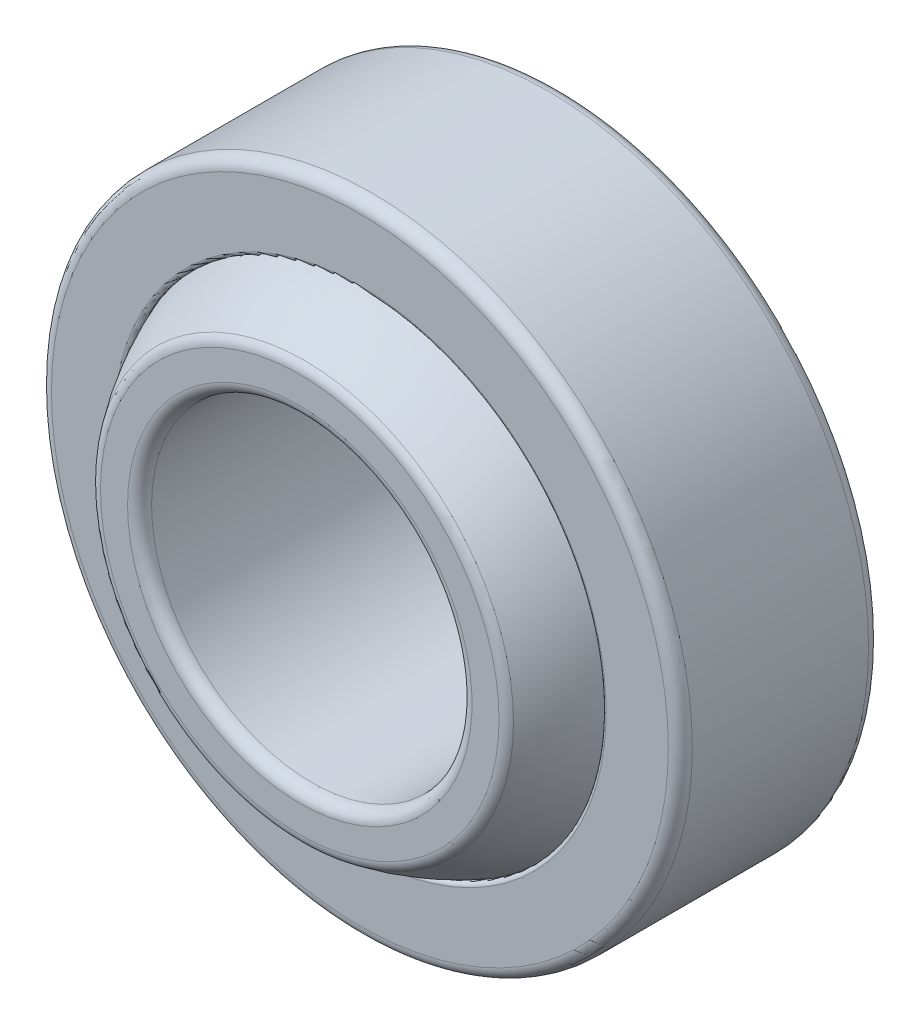
ISO-10303-21;
HEADER;
FILE_DESCRIPTION(('STEP AP214'),'2;1');
FILE_NAME('part.step','',(''),(''),'','','');
FILE_SCHEMA(('AUTOMOTIVE_DESIGN { 1 0 10303 214 1 1 1 1 }'));
ENDSEC;
DATA;
#1=APPLICATION_CONTEXT('core data for automotive mechanical design processes');
#2=APPLICATION_PROTOCOL_DEFINITION('international standard','automotive_design',2000,#1);
#3=PRODUCT_CONTEXT('',#1,'mechanical');
#4=PRODUCT('Part','Part','',(#3));
#5=PRODUCT_RELATED_PRODUCT_CATEGORY('part','',(#4));
#6=PRODUCT_DEFINITION_FORMATION('','',#4);
#7=PRODUCT_DEFINITION_CONTEXT('part definition',#1,'design');
#8=PRODUCT_DEFINITION('design','',#6,#7);
#9=PRODUCT_DEFINITION_SHAPE('','',#8);
#10=(LENGTH_UNIT() NAMED_UNIT(*) SI_UNIT(.MILLI.,.METRE.));
#11=(NAMED_UNIT(*) PLANE_ANGLE_UNIT() SI_UNIT($,.RADIAN.));
#12=(NAMED_UNIT(*) SI_UNIT($,.STERADIAN.) SOLID_ANGLE_UNIT());
#13=UNCERTAINTY_MEASURE_WITH_UNIT(LENGTH_MEASURE(1.E-05),#10,'distance_accuracy_value','');
#14=(GEOMETRIC_REPRESENTATION_CONTEXT(3) GLOBAL_UNCERTAINTY_ASSIGNED_CONTEXT((#13)) GLOBAL_UNIT_ASSIGNED_CONTEXT((#10,
#11,#12)) REPRESENTATION_CONTEXT('',''));
#15=CARTESIAN_POINT('',(0.,0.,0.));
#16=DIRECTION('',(0.,0.,1.));
#17=DIRECTION('',(1.,0.,0.));
#18=AXIS2_PLACEMENT_3D('',#15,#16,#17);
#19=CARTESIAN_POINT('',(0.,0.,0.));
#20=DIRECTION('',(-1.,0.,0.));
#21=DIRECTION('',(0.,0.,-1.));
#22=AXIS2_PLACEMENT_3D('',#19,#20,#21);
#23=SPHERICAL_SURFACE('',#22,6.5);
#24=CARTESIAN_POINT('',(0.,0.,0.));
#25=DIRECTION('',(0.,0.,1.));
#26=DIRECTION('',(1.,0.,0.));
#27=AXIS2_PLACEMENT_3D('',#24,#25,#26);
#28=SPHERICAL_SURFACE('',#27,6.5);
#29=CARTESIAN_POINT('',(0.,0.,-3.87903225806452));
#30=DIRECTION('',(0.,0.,1.));
#31=DIRECTION('',(1.,0.,0.));
#32=AXIS2_PLACEMENT_3D('',#29,#30,#31);
#33=CIRCLE('',#32,5.21565995257502);
#34=CARTESIAN_POINT('',(5.21565995257502,0.,-3.87903225806452));
#35=VERTEX_POINT('',#34);
#36=EDGE_CURVE('P0_E49',#35,#35,#33,.T.);
#37=ORIENTED_EDGE('',*,*,#36,.T.);
#38=EDGE_LOOP('',(#37));
#39=FACE_BOUND('',#38,.T.);
#40=CARTESIAN_POINT('',(0.,0.,3.87903225806452));
#41=DIRECTION('',(0.,0.,-1.));
#42=DIRECTION('',(-1.,0.,0.));
#43=AXIS2_PLACEMENT_3D('',#40,#41,#42);
#44=CIRCLE('',#43,5.21565995257502);
#45=CARTESIAN_POINT('',(-5.21565995257502,0.,3.87903225806452));
#46=VERTEX_POINT('',#45);
#47=EDGE_CURVE('P0_E53',#46,#46,#44,.T.);
#48=ORIENTED_EDGE('',*,*,#47,.T.);
#49=EDGE_LOOP('',(#48));
#50=FACE_BOUND('',#49,.T.);
#51=ADVANCED_FACE('P0_F14',(#39,#50),#28,.T.);
#52=CARTESIAN_POINT('',(-5.75777978288146,-6.5,4.));
#53=DIRECTION('',(0.,0.,-1.));
#54=DIRECTION('',(-1.,0.,0.));
#55=AXIS2_PLACEMENT_3D('',#52,#53,#54);
#56=PLANE('',#55);
#57=CARTESIAN_POINT('',(0.,0.,4.));
#58=DIRECTION('',(0.,0.,-1.));
#59=DIRECTION('',(-1.,0.,0.));
#60=AXIS2_PLACEMENT_3D('',#57,#58,#59);
#61=CIRCLE('',#60,4.9749371855331);
#62=CARTESIAN_POINT('',(-4.9749371855331,0.,4.));
#63=VERTEX_POINT('',#62);
#64=EDGE_CURVE('P0_E29',#63,#63,#61,.F.);
#65=ORIENTED_EDGE('',*,*,#64,.T.);
#66=EDGE_LOOP('',(#65));
#67=FACE_BOUND('',#66,.T.);
#68=CARTESIAN_POINT('',(0.,0.,4.));
#69=DIRECTION('',(0.,0.,-1.));
#70=DIRECTION('',(-1.,0.,0.));
#71=AXIS2_PLACEMENT_3D('',#68,#69,#70);
#72=CIRCLE('',#71,4.3);
#73=CARTESIAN_POINT('',(-4.3,0.,4.));
#74=VERTEX_POINT('',#73);
#75=EDGE_CURVE('P0_E35',#74,#74,#72,.T.);
#76=ORIENTED_EDGE('',*,*,#75,.T.);
#77=EDGE_LOOP('',(#76));
#78=FACE_BOUND('',#77,.T.);
#79=ADVANCED_FACE('P0_F77',(#67,#78),#56,.F.);
#80=CARTESIAN_POINT('',(-5.75777978288146,-6.5,-4.));
#81=DIRECTION('',(0.,0.,1.));
#82=DIRECTION('',(1.,0.,0.));
#83=AXIS2_PLACEMENT_3D('',#80,#81,#82);
#84=PLANE('',#83);
#85=CARTESIAN_POINT('',(0.,0.,-4.));
#86=DIRECTION('',(0.,0.,1.));
#87=DIRECTION('',(1.,0.,0.));
#88=AXIS2_PLACEMENT_3D('',#85,#86,#87);
#89=CIRCLE('',#88,4.9749371855331);
#90=CARTESIAN_POINT('',(4.9749371855331,0.,-4.));
#91=VERTEX_POINT('',#90);
#92=EDGE_CURVE('P0_E41',#91,#91,#89,.F.);
#93=ORIENTED_EDGE('',*,*,#92,.T.);
#94=EDGE_LOOP('',(#93));
#95=FACE_BOUND('',#94,.T.);
#96=CARTESIAN_POINT('',(0.,0.,-4.));
#97=DIRECTION('',(0.,0.,1.));
#98=DIRECTION('',(1.,0.,0.));
#99=AXIS2_PLACEMENT_3D('',#96,#97,#98);
#100=CIRCLE('',#99,4.3);
#101=CARTESIAN_POINT('',(4.3,0.,-4.));
#102=VERTEX_POINT('',#101);
#103=EDGE_CURVE('P0_E45',#102,#102,#100,.T.);
#104=ORIENTED_EDGE('',*,*,#103,.T.);
#105=EDGE_LOOP('',(#104));
#106=FACE_BOUND('',#105,.T.);
#107=ADVANCED_FACE('P0_F83',(#95,#106),#84,.F.);
#108=CARTESIAN_POINT('',(0.,0.,6.));
#109=DIRECTION('',(0.,0.,-1.));
#110=DIRECTION('',(-1.,0.,0.));
#111=AXIS2_PLACEMENT_3D('',#108,#109,#110);
#112=CYLINDRICAL_SURFACE('',#111,4.);
#113=CARTESIAN_POINT('',(0.,0.,3.7));
#114=DIRECTION('',(0.,0.,-1.));
#115=DIRECTION('',(-1.,0.,0.));
#116=AXIS2_PLACEMENT_3D('',#113,#114,#115);
#117=CIRCLE('',#116,4.);
#118=CARTESIAN_POINT('',(-4.,0.,3.7));
#119=VERTEX_POINT('',#118);
#120=EDGE_CURVE('P0_E10',#119,#119,#117,.F.);
#121=ORIENTED_EDGE('',*,*,#120,.T.);
#122=EDGE_LOOP('',(#121));
#123=FACE_BOUND('',#122,.T.);
#124=CARTESIAN_POINT('',(0.,0.,-3.7));
#125=DIRECTION('',(0.,0.,1.));
#126=DIRECTION('',(1.,0.,0.));
#127=AXIS2_PLACEMENT_3D('',#124,#125,#126);
#128=CIRCLE('',#127,4.);
#129=CARTESIAN_POINT('',(4.,0.,-3.7));
#130=VERTEX_POINT('',#129);
#131=EDGE_CURVE('P0_E22',#130,#130,#128,.F.);
#132=ORIENTED_EDGE('',*,*,#131,.T.);
#133=EDGE_LOOP('',(#132));
#134=FACE_BOUND('',#133,.T.);
#135=ADVANCED_FACE('P0_F72',(#123,#134),#112,.F.);
#136=CARTESIAN_POINT('',(0.,0.,-3.7));
#137=DIRECTION('',(0.,0.,1.));
#138=DIRECTION('',(1.,0.,0.));
#139=AXIS2_PLACEMENT_3D('',#136,#137,#138);
#140=TOROIDAL_SURFACE('',#139,4.9749371855331,0.3);
#141=ORIENTED_EDGE('',*,*,#92,.F.);
#142=EDGE_LOOP('',(#141));
#143=FACE_BOUND('',#142,.T.);
#144=ORIENTED_EDGE('',*,*,#36,.F.);
#145=EDGE_LOOP('',(#144));
#146=FACE_BOUND('',#145,.T.);
#147=ADVANCED_FACE('P0_F63',(#143,#146),#140,.T.);
#148=CARTESIAN_POINT('',(0.,0.,3.7));
#149=DIRECTION('',(0.,0.,-1.));
#150=DIRECTION('',(-1.,0.,0.));
#151=AXIS2_PLACEMENT_3D('',#148,#149,#150);
#152=TOROIDAL_SURFACE('',#151,4.9749371855331,0.3);
#153=ORIENTED_EDGE('',*,*,#64,.F.);
#154=EDGE_LOOP('',(#153));
#155=FACE_BOUND('',#154,.T.);
#156=ORIENTED_EDGE('',*,*,#47,.F.);
#157=EDGE_LOOP('',(#156));
#158=FACE_BOUND('',#157,.T.);
#159=ADVANCED_FACE('P0_F60',(#155,#158),#152,.T.);
#160=CARTESIAN_POINT('',(0.,0.,3.7));
#161=DIRECTION('',(0.,0.,-1.));
#162=DIRECTION('',(-1.,0.,0.));
#163=AXIS2_PLACEMENT_3D('',#160,#161,#162);
#164=TOROIDAL_SURFACE('',#163,4.3,0.3);
#165=ORIENTED_EDGE('',*,*,#120,.F.);
#166=EDGE_LOOP('',(#165));
#167=FACE_BOUND('',#166,.T.);
#168=ORIENTED_EDGE('',*,*,#75,.F.);
#169=EDGE_LOOP('',(#168));
#170=FACE_BOUND('',#169,.T.);
#171=ADVANCED_FACE('P0_F62',(#167,#170),#164,.T.);
#172=CARTESIAN_POINT('',(0.,0.,-3.7));
#173=DIRECTION('',(0.,0.,1.));
#174=DIRECTION('',(1.,0.,0.));
#175=AXIS2_PLACEMENT_3D('',#172,#173,#174);
#176=TOROIDAL_SURFACE('',#175,4.3,0.3);
#177=ORIENTED_EDGE('',*,*,#103,.F.);
#178=EDGE_LOOP('',(#177));
#179=FACE_BOUND('',#178,.T.);
#180=ORIENTED_EDGE('',*,*,#131,.F.);
#181=EDGE_LOOP('',(#180));
#182=FACE_BOUND('',#181,.T.);
#183=ADVANCED_FACE('P0_F16',(#179,#182),#176,.T.);
#184=CLOSED_SHELL('',(#51,#79,#107,#135,#147,#159,#171,#183));
#185=MANIFOLD_SOLID_BREP('P0_B1',#184);
#186=CARTESIAN_POINT('',(0.,0.,0.));
#187=DIRECTION('',(0.,0.,-1.));
#188=DIRECTION('',(-1.,0.,0.));
#189=AXIS2_PLACEMENT_3D('',#186,#187,#188);
#190=CYLINDRICAL_SURFACE('',#189,8.);
#191=CARTESIAN_POINT('',(0.,0.,-2.2));
#192=DIRECTION('',(0.,0.,1.));
#193=DIRECTION('',(1.,0.,0.));
#194=AXIS2_PLACEMENT_3D('',#191,#192,#193);
#195=CIRCLE('',#194,8.);
#196=CARTESIAN_POINT('',(8.,0.,-2.2));
#197=VERTEX_POINT('',#196);
#198=EDGE_CURVE('P1_E45',#197,#197,#195,.T.);
#199=ORIENTED_EDGE('',*,*,#198,.T.);
#200=EDGE_LOOP('',(#199));
#201=FACE_BOUND('',#200,.T.);
#202=CARTESIAN_POINT('',(0.,0.,2.2));
#203=DIRECTION('',(0.,0.,-1.));
#204=DIRECTION('',(-1.,0.,0.));
#205=AXIS2_PLACEMENT_3D('',#202,#203,#204);
#206=CIRCLE('',#205,8.);
#207=CARTESIAN_POINT('',(-8.,0.,2.2));
#208=VERTEX_POINT('',#207);
#209=EDGE_CURVE('P1_E49',#208,#208,#206,.T.);
#210=ORIENTED_EDGE('',*,*,#209,.T.);
#211=EDGE_LOOP('',(#210));
#212=FACE_BOUND('',#211,.T.);
#213=ADVANCED_FACE('P1_F14',(#201,#212),#190,.T.);
#214=CARTESIAN_POINT('',(6.,0.,-2.5));
#215=DIRECTION('',(0.,0.,1.));
#216=DIRECTION('',(1.,0.,0.));
#217=AXIS2_PLACEMENT_3D('',#214,#215,#216);
#218=PLANE('',#217);
#219=CARTESIAN_POINT('',(0.,0.,-2.5));
#220=DIRECTION('',(0.,0.,1.));
#221=DIRECTION('',(1.,0.,0.));
#222=AXIS2_PLACEMENT_3D('',#219,#220,#221);
#223=CIRCLE('',#222,6.14817045957576);
#224=CARTESIAN_POINT('',(6.14817045957576,0.,-2.5));
#225=VERTEX_POINT('',#224);
#226=EDGE_CURVE('P1_E10',#225,#225,#223,.T.);
#227=ORIENTED_EDGE('',*,*,#226,.T.);
#228=EDGE_LOOP('',(#227));
#229=FACE_BOUND('',#228,.T.);
#230=CARTESIAN_POINT('',(0.,0.,-2.5));
#231=DIRECTION('',(0.,0.,1.));
#232=DIRECTION('',(1.,0.,0.));
#233=AXIS2_PLACEMENT_3D('',#230,#231,#232);
#234=CIRCLE('',#233,7.7);
#235=CARTESIAN_POINT('',(7.7,0.,-2.5));
#236=VERTEX_POINT('',#235);
#237=EDGE_CURVE('P1_E53',#236,#236,#234,.F.);
#238=ORIENTED_EDGE('',*,*,#237,.T.);
#239=EDGE_LOOP('',(#238));
#240=FACE_BOUND('',#239,.T.);
#241=ADVANCED_FACE('P1_F59',(#229,#240),#218,.F.);
#242=CARTESIAN_POINT('',(0.,0.,0.));
#243=DIRECTION('',(0.,0.,-1.));
#244=DIRECTION('',(1.,0.,0.));
#245=AXIS2_PLACEMENT_3D('',#242,#243,#244);
#246=SPHERICAL_SURFACE('',#245,6.5);
#247=CARTESIAN_POINT('',(0.,0.,2.36363636363636));
#248=DIRECTION('',(0.,0.,-1.));
#249=DIRECTION('',(-1.,0.,0.));
#250=AXIS2_PLACEMENT_3D('',#247,#248,#249);
#251=CIRCLE('',#250,6.0550163617034);
#252=CARTESIAN_POINT('',(6.0550163617034,0.,2.36363636363636));
#253=VERTEX_POINT('',#252);
#254=EDGE_CURVE('P1_E22',#253,#253,#251,.F.);
#255=CARTESIAN_POINT('',(0.,0.,-2.36363636363636));
#256=DIRECTION('',(0.,0.,1.));
#257=DIRECTION('',(1.,0.,0.));
#258=AXIS2_PLACEMENT_3D('',#255,#256,#257);
#259=CIRCLE('',#258,6.0550163617034);
#260=CARTESIAN_POINT('',(6.0550163617034,0.,-2.36363636363636));
#261=VERTEX_POINT('',#260);
#262=EDGE_CURVE('P1_E29',#261,#261,#259,.F.);
#263=CARTESIAN_POINT('',(6.0550163617034,0.,2.36363636363636));
#264=CARTESIAN_POINT('',(6.07334294953804,0.,2.31668876593016));
#265=CARTESIAN_POINT('',(6.09112331384484,0.,2.2695279493168));
#266=CARTESIAN_POINT('',(6.12558244577368,0.,2.17480556459772));
#267=CARTESIAN_POINT('',(6.14226121339572,0.,2.127243996492));
#268=CARTESIAN_POINT('',(6.17450800232595,0.,2.03174579511016));
#269=CARTESIAN_POINT('',(6.19007602363415,0.,1.98380916183403));
#270=CARTESIAN_POINT('',(6.22009293094876,0.,1.88758677745025));
#271=CARTESIAN_POINT('',(6.23454181695518,0.,1.83930102634259));
#272=CARTESIAN_POINT('',(6.26231262737139,0.,1.74240652695032));
#273=CARTESIAN_POINT('',(6.27563455178118,0.,1.69379777866571));
#274=CARTESIAN_POINT('',(6.30114423389274,0.,1.59628358449576));
#275=CARTESIAN_POINT('',(6.31333199159452,0.,1.54737813861042));
#276=CARTESIAN_POINT('',(6.33656674572243,0.,1.44929700821931));
#277=CARTESIAN_POINT('',(6.34761374214856,0.,1.40012132371353));
#278=CARTESIAN_POINT('',(6.36856099716455,0.,1.30152632156797));
#279=CARTESIAN_POINT('',(6.37846125575441,0.,1.25210700392819));
#280=CARTESIAN_POINT('',(6.39710967873397,0.,1.15305147273314));
#281=CARTESIAN_POINT('',(6.40585784312366,0.,1.10341525917788));
#282=CARTESIAN_POINT('',(6.42219734471331,0.,1.00395279073869));
#283=CARTESIAN_POINT('',(6.42978868191328,0.,0.954126535854756));
#284=CARTESIAN_POINT('',(6.44381042199402,0.,0.854310942156952));
#285=CARTESIAN_POINT('',(6.45024082487479,0.,0.804321603343079));
#286=CARTESIAN_POINT('',(6.46193721728991,0.,0.704206887418636));
#287=CARTESIAN_POINT('',(6.46720320682426,0.,0.654081510308066));
#288=CARTESIAN_POINT('',(6.47656792349841,0.,0.553721837023592));
#289=CARTESIAN_POINT('',(6.48066665063821,0.,0.503487540849688));
#290=CARTESIAN_POINT('',(6.4876946249971,0.,0.402937207600284));
#291=CARTESIAN_POINT('',(6.4906238722162,0.,0.352621170524785));
#292=CARTESIAN_POINT('',(6.49531130192884,0.,0.251934577858016));
#293=CARTESIAN_POINT('',(6.4970694844224,0.,0.201564022266746));
#294=CARTESIAN_POINT('',(6.49941383345798,0.,0.100795644450318));
#295=CARTESIAN_POINT('',(6.5,0.,0.0503978222251591));
#296=CARTESIAN_POINT('',(6.5,0.,-0.0503978222251591));
#297=CARTESIAN_POINT('',(6.49941383345798,0.,-0.100795644450318));
#298=CARTESIAN_POINT('',(6.4970694844224,0.,-0.201564022266746));
#299=CARTESIAN_POINT('',(6.49531130192884,0.,-0.251934577858016));
#300=CARTESIAN_POINT('',(6.4906238722162,0.,-0.352621170524785));
#301=CARTESIAN_POINT('',(6.4876946249971,0.,-0.402937207600284));
#302=CARTESIAN_POINT('',(6.48066665063821,0.,-0.503487540849688));
#303=CARTESIAN_POINT('',(6.47656792349841,0.,-0.553721837023592));
#304=CARTESIAN_POINT('',(6.46720320682426,0.,-0.654081510308066));
#305=CARTESIAN_POINT('',(6.46193721728991,0.,-0.704206887418636));
#306=CARTESIAN_POINT('',(6.45024082487479,0.,-0.804321603343079));
#307=CARTESIAN_POINT('',(6.44381042199402,0.,-0.854310942156952));
#308=CARTESIAN_POINT('',(6.42978868191328,0.,-0.954126535854756));
#309=CARTESIAN_POINT('',(6.42219734471331,0.,-1.00395279073869));
#310=CARTESIAN_POINT('',(6.40585784312366,0.,-1.10341525917788));
#311=CARTESIAN_POINT('',(6.39710967873397,0.,-1.15305147273314));
#312=CARTESIAN_POINT('',(6.37846125575441,0.,-1.25210700392819));
#313=CARTESIAN_POINT('',(6.36856099716455,0.,-1.30152632156797));
#314=CARTESIAN_POINT('',(6.34761374214856,0.,-1.40012132371353));
#315=CARTESIAN_POINT('',(6.33656674572243,0.,-1.44929700821931));
#316=CARTESIAN_POINT('',(6.31333199159452,0.,-1.54737813861042));
#317=CARTESIAN_POINT('',(6.30114423389274,0.,-1.59628358449576));
#318=CARTESIAN_POINT('',(6.27563455178118,0.,-1.69379777866571));
#319=CARTESIAN_POINT('',(6.26231262737139,0.,-1.74240652695032));
#320=CARTESIAN_POINT('',(6.23454181695518,0.,-1.83930102634259));
#321=CARTESIAN_POINT('',(6.22009293094876,0.,-1.88758677745025));
#322=CARTESIAN_POINT('',(6.19007602363414,0.,-1.98380916183403));
#323=CARTESIAN_POINT('',(6.17450800232595,0.,-2.03174579511016));
#324=CARTESIAN_POINT('',(6.14226121339572,0.,-2.127243996492));
#325=CARTESIAN_POINT('',(6.12558244577368,0.,-2.17480556459772));
#326=CARTESIAN_POINT('',(6.09112331384484,0.,-2.2695279493168));
#327=CARTESIAN_POINT('',(6.07334294953804,0.,-2.31668876593016));
#328=CARTESIAN_POINT('',(6.0550163617034,0.,-2.36363636363636));
#329=B_SPLINE_CURVE_WITH_KNOTS('',3,(#263,#264,#265,#266,#267,#268,#269,#270,#271,#272,#273,
#274,#275,#276,#277,#278,#279,#280,#281,#282,#283,#284,#285,#286,#287,#288,#289,#290,#291,#292,
#293,#294,#295,#296,#297,#298,#299,#300,#301,#302,#303,#304,#305,#306,#307,#308,#309,#310,#311,
#312,#313,#314,#315,#316,#317,#318,#319,#320,#321,#322,#323,#324,#325,#326,#327,#328),
.UNSPECIFIED.,.F.,.F.,(4,2,2,2,2,2,2,2,2,2,2,2,2,2,2,2,2,2,2,2,2,2,2,2,2,2,2,2,2,2,2,2,4),(0.,
0.151190058461514,0.30238011692303,0.453570175384544,0.604760233846059,0.755950292307574,
0.907140350769088,1.0583304092306,1.20952046769212,1.36071052615363,1.51190058461515,
1.66309064307666,1.81428070153818,1.96547075999969,2.11666081846121,2.26785087692272,
2.41904093538424,2.57023099384575,2.72142105230727,2.87261111076878,3.0238011692303,
3.17499122769181,3.32618128615333,3.47737134461484,3.62856140307635,3.77975146153787,
3.93094151999939,4.0821315784609,4.23332163692241,4.38451169538393,4.53570175384544,
4.68689181230696,4.83808187076847),.UNSPECIFIED.);
#330=EDGE_CURVE('P1_BSEAM75',#253,#261,#329,.T.);
#331=ORIENTED_EDGE('',*,*,#254,.T.);
#332=ORIENTED_EDGE('',*,*,#262,.T.);
#333=ORIENTED_EDGE('',*,*,#330,.T.);
#334=ORIENTED_EDGE('',*,*,#330,.F.);
#335=EDGE_LOOP('',(#331,#333,#332,#334));
#336=FACE_BOUND('',#335,.T.);
#337=ADVANCED_FACE('P1_F75',(#336),#246,.F.);
#338=CARTESIAN_POINT('',(6.,0.,2.5));
#339=DIRECTION('',(0.,0.,-1.));
#340=DIRECTION('',(-1.,0.,0.));
#341=AXIS2_PLACEMENT_3D('',#338,#339,#340);
#342=PLANE('',#341);
#343=CARTESIAN_POINT('',(0.,0.,2.5));
#344=DIRECTION('',(0.,0.,-1.));
#345=DIRECTION('',(-1.,0.,0.));
#346=AXIS2_PLACEMENT_3D('',#343,#344,#345);
#347=CIRCLE('',#346,6.14817045957576);
#348=CARTESIAN_POINT('',(-6.14817045957576,0.,2.5));
#349=VERTEX_POINT('',#348);
#350=EDGE_CURVE('P1_E35',#349,#349,#347,.T.);
#351=ORIENTED_EDGE('',*,*,#350,.T.);
#352=EDGE_LOOP('',(#351));
#353=FACE_BOUND('',#352,.T.);
#354=CARTESIAN_POINT('',(0.,0.,2.5));
#355=DIRECTION('',(0.,0.,-1.));
#356=DIRECTION('',(-1.,0.,0.));
#357=AXIS2_PLACEMENT_3D('',#354,#355,#356);
#358=CIRCLE('',#357,7.7);
#359=CARTESIAN_POINT('',(-7.7,0.,2.5));
#360=VERTEX_POINT('',#359);
#361=EDGE_CURVE('P1_E41',#360,#360,#358,.F.);
#362=ORIENTED_EDGE('',*,*,#361,.T.);
#363=EDGE_LOOP('',(#362));
#364=FACE_BOUND('',#363,.T.);
#365=ADVANCED_FACE('P1_F64',(#353,#364),#342,.F.);
#366=CARTESIAN_POINT('',(0.,0.,-2.2));
#367=DIRECTION('',(0.,0.,1.));
#368=DIRECTION('',(1.,0.,0.));
#369=AXIS2_PLACEMENT_3D('',#366,#367,#368);
#370=TOROIDAL_SURFACE('',#369,7.7,0.3);
#371=ORIENTED_EDGE('',*,*,#198,.F.);
#372=EDGE_LOOP('',(#371));
#373=FACE_BOUND('',#372,.T.);
#374=ORIENTED_EDGE('',*,*,#237,.F.);
#375=EDGE_LOOP('',(#374));
#376=FACE_BOUND('',#375,.T.);
#377=ADVANCED_FACE('P1_F61',(#373,#376),#370,.T.);
#378=CARTESIAN_POINT('',(0.,0.,2.2));
#379=DIRECTION('',(0.,0.,-1.));
#380=DIRECTION('',(-1.,0.,0.));
#381=AXIS2_PLACEMENT_3D('',#378,#379,#380);
#382=TOROIDAL_SURFACE('',#381,7.7,0.3);
#383=ORIENTED_EDGE('',*,*,#361,.F.);
#384=EDGE_LOOP('',(#383));
#385=FACE_BOUND('',#384,.T.);
#386=ORIENTED_EDGE('',*,*,#209,.F.);
#387=EDGE_LOOP('',(#386));
#388=FACE_BOUND('',#387,.T.);
#389=ADVANCED_FACE('P1_F63',(#385,#388),#382,.T.);
#390=CARTESIAN_POINT('',(0.,0.,2.4));
#391=DIRECTION('',(0.,0.,-1.));
#392=DIRECTION('',(-1.,0.,0.));
#393=AXIS2_PLACEMENT_3D('',#390,#391,#392);
#394=TOROIDAL_SURFACE('',#393,6.14817045957576,0.1);
#395=ORIENTED_EDGE('',*,*,#254,.F.);
#396=EDGE_LOOP('',(#395));
#397=FACE_BOUND('',#396,.T.);
#398=ORIENTED_EDGE('',*,*,#350,.F.);
#399=EDGE_LOOP('',(#398));
#400=FACE_BOUND('',#399,.T.);
#401=ADVANCED_FACE('P1_F72',(#397,#400),#394,.T.);
#402=CARTESIAN_POINT('',(0.,0.,-2.4));
#403=DIRECTION('',(0.,0.,1.));
#404=DIRECTION('',(1.,0.,0.));
#405=AXIS2_PLACEMENT_3D('',#402,#403,#404);
#406=TOROIDAL_SURFACE('',#405,6.14817045957576,0.1);
#407=ORIENTED_EDGE('',*,*,#226,.F.);
#408=EDGE_LOOP('',(#407));
#409=FACE_BOUND('',#408,.T.);
#410=ORIENTED_EDGE('',*,*,#262,.F.);
#411=EDGE_LOOP('',(#410));
#412=FACE_BOUND('',#411,.T.);
#413=ADVANCED_FACE('P1_F16',(#409,#412),#406,.T.);
#414=CLOSED_SHELL('',(#213,#241,#337,#365,#377,#389,#401,#413));
#415=MANIFOLD_SOLID_BREP('P1_B1',#414);
#416=ADVANCED_BREP_SHAPE_REPRESENTATION('',(#18,#185,#415),#14);
#417=SHAPE_DEFINITION_REPRESENTATION(#9,#416);
ENDSEC;
END-ISO-10303-21;
